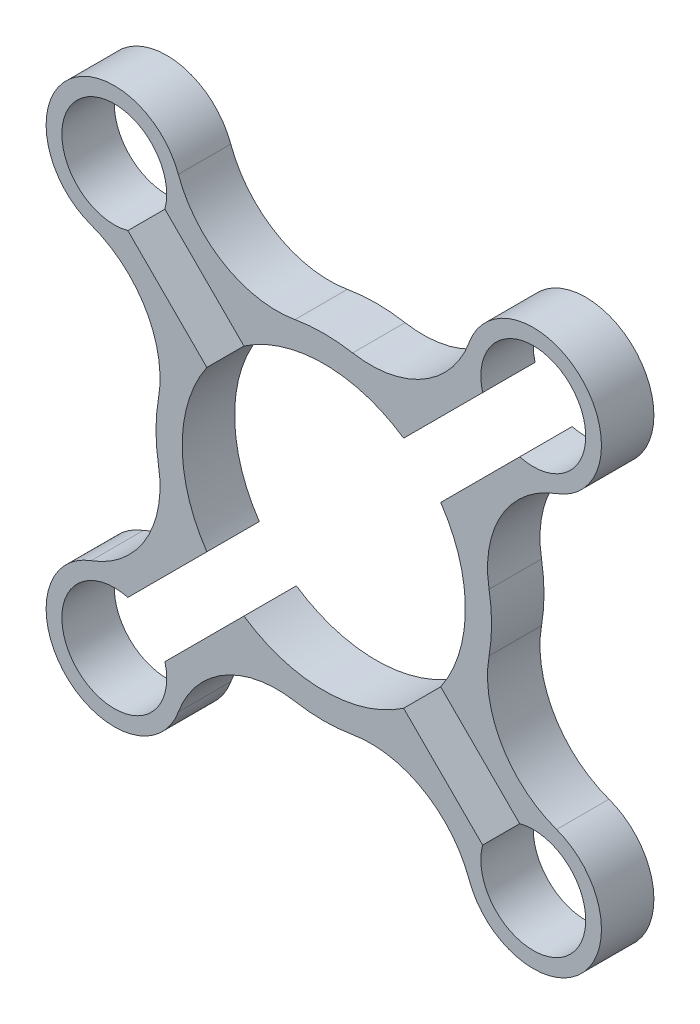
ISO-10303-21;
HEADER;
FILE_DESCRIPTION(('STEP AP214'),'2;1');
FILE_NAME('part.step','',(''),(''),'','','');
FILE_SCHEMA(('AUTOMOTIVE_DESIGN { 1 0 10303 214 1 1 1 1 }'));
ENDSEC;
DATA;
#1=APPLICATION_CONTEXT('core data for automotive mechanical design processes');
#2=APPLICATION_PROTOCOL_DEFINITION('international standard','automotive_design',2000,#1);
#3=PRODUCT_CONTEXT('',#1,'mechanical');
#4=PRODUCT('Part','Part','',(#3));
#5=PRODUCT_RELATED_PRODUCT_CATEGORY('part','',(#4));
#6=PRODUCT_DEFINITION_FORMATION('','',#4);
#7=PRODUCT_DEFINITION_CONTEXT('part definition',#1,'design');
#8=PRODUCT_DEFINITION('design','',#6,#7);
#9=PRODUCT_DEFINITION_SHAPE('','',#8);
#10=(LENGTH_UNIT() NAMED_UNIT(*) SI_UNIT(.MILLI.,.METRE.));
#11=(NAMED_UNIT(*) PLANE_ANGLE_UNIT() SI_UNIT($,.RADIAN.));
#12=(NAMED_UNIT(*) SI_UNIT($,.STERADIAN.) SOLID_ANGLE_UNIT());
#13=UNCERTAINTY_MEASURE_WITH_UNIT(LENGTH_MEASURE(1.E-05),#10,'distance_accuracy_value','');
#14=(GEOMETRIC_REPRESENTATION_CONTEXT(3) GLOBAL_UNCERTAINTY_ASSIGNED_CONTEXT((#13)) GLOBAL_UNIT_ASSIGNED_CONTEXT((#10,
#11,#12)) REPRESENTATION_CONTEXT('',''));
#15=CARTESIAN_POINT('',(0.,0.,0.));
#16=DIRECTION('',(0.,0.,1.));
#17=DIRECTION('',(1.,0.,0.));
#18=AXIS2_PLACEMENT_3D('',#15,#16,#17);
#19=CARTESIAN_POINT('',(51.2262080806969,-8.93731535043631,5.));
#20=DIRECTION('',(0.,0.,-1.));
#21=DIRECTION('',(-1.,0.,0.));
#22=AXIS2_PLACEMENT_3D('',#19,#20,#21);
#23=CYLINDRICAL_SURFACE('',#22,20.);
#24=CARTESIAN_POINT('',(51.2262080806969,-8.93731535043631,-5.));
#25=DIRECTION('',(0.,0.,1.));
#26=DIRECTION('',(1.,0.,0.));
#27=AXIS2_PLACEMENT_3D('',#24,#25,#26);
#28=CIRCLE('',#27,20.);
#29=CARTESIAN_POINT('',(31.5238203573519,-5.49988636949927,-5.));
#30=VERTEX_POINT('',#29);
#31=CARTESIAN_POINT('',(44.3930717512079,-27.7338109786809,-5.));
#32=VERTEX_POINT('',#31);
#33=EDGE_CURVE('E442',#30,#32,#28,.T.);
#34=ORIENTED_EDGE('',*,*,#33,.F.);
#35=DIRECTION('',(0.,0.,-1.));
#36=VECTOR('',#35,1.);
#37=CARTESIAN_POINT('',(31.5238203573519,-5.49988636949927,5.));
#38=LINE('',#37,#36);
#39=CARTESIAN_POINT('',(31.5238203573519,-5.49988636949927,5.));
#40=VERTEX_POINT('',#39);
#41=EDGE_CURVE('E11',#40,#30,#38,.T.);
#42=ORIENTED_EDGE('',*,*,#41,.F.);
#43=CARTESIAN_POINT('',(51.2262080806969,-8.93731535043631,5.));
#44=DIRECTION('',(0.,0.,1.));
#45=DIRECTION('',(1.,0.,0.));
#46=AXIS2_PLACEMENT_3D('',#43,#44,#45);
#47=CIRCLE('',#46,20.);
#48=CARTESIAN_POINT('',(44.3930717512079,-27.7338109786809,5.));
#49=VERTEX_POINT('',#48);
#50=EDGE_CURVE('E553',#40,#49,#47,.T.);
#51=ORIENTED_EDGE('',*,*,#50,.T.);
#52=DIRECTION('',(0.,0.,-1.));
#53=VECTOR('',#52,1.);
#54=CARTESIAN_POINT('',(44.3930717512079,-27.7338109786809,5.));
#55=LINE('',#54,#53);
#56=EDGE_CURVE('E169',#49,#32,#55,.T.);
#57=ORIENTED_EDGE('',*,*,#56,.T.);
#58=EDGE_LOOP('',(#34,#42,#51,#57));
#59=FACE_BOUND('',#58,.T.);
#60=ADVANCED_FACE('F43',(#59),#23,.F.);
#61=CARTESIAN_POINT('',(0.,0.,5.));
#62=DIRECTION('',(0.,0.,-1.));
#63=DIRECTION('',(-1.,0.,0.));
#64=AXIS2_PLACEMENT_3D('',#61,#62,#63);
#65=CYLINDRICAL_SURFACE('',#64,32.);
#66=CARTESIAN_POINT('',(0.,0.,-5.));
#67=DIRECTION('',(0.,0.,1.));
#68=DIRECTION('',(1.,0.,0.));
#69=AXIS2_PLACEMENT_3D('',#66,#67,#68);
#70=CIRCLE('',#69,32.);
#71=CARTESIAN_POINT('',(31.5238203573519,5.4998863694994,-5.));
#72=VERTEX_POINT('',#71);
#73=EDGE_CURVE('E438',#30,#72,#70,.T.);
#74=ORIENTED_EDGE('',*,*,#73,.T.);
#75=DIRECTION('',(0.,0.,-1.));
#76=VECTOR('',#75,1.);
#77=CARTESIAN_POINT('',(31.5238203573519,5.4998863694994,5.));
#78=LINE('',#77,#76);
#79=CARTESIAN_POINT('',(31.5238203573519,5.4998863694994,5.));
#80=VERTEX_POINT('',#79);
#81=EDGE_CURVE('E54',#80,#72,#78,.T.);
#82=ORIENTED_EDGE('',*,*,#81,.F.);
#83=CARTESIAN_POINT('',(0.,0.,5.));
#84=DIRECTION('',(0.,0.,1.));
#85=DIRECTION('',(1.,0.,0.));
#86=AXIS2_PLACEMENT_3D('',#83,#84,#85);
#87=CIRCLE('',#86,32.);
#88=EDGE_CURVE('E549',#40,#80,#87,.T.);
#89=ORIENTED_EDGE('',*,*,#88,.F.);
#90=ORIENTED_EDGE('',*,*,#41,.T.);
#91=EDGE_LOOP('',(#74,#82,#89,#90));
#92=FACE_BOUND('',#91,.T.);
#93=ADVANCED_FACE('F683',(#92),#65,.T.);
#94=CARTESIAN_POINT('',(51.2262080806969,8.93731535043653,5.));
#95=DIRECTION('',(0.,0.,-1.));
#96=DIRECTION('',(-1.,0.,0.));
#97=AXIS2_PLACEMENT_3D('',#94,#95,#96);
#98=CYLINDRICAL_SURFACE('',#97,20.);
#99=CARTESIAN_POINT('',(51.2262080806969,8.93731535043653,-5.));
#100=DIRECTION('',(0.,0.,1.));
#101=DIRECTION('',(1.,0.,0.));
#102=AXIS2_PLACEMENT_3D('',#99,#100,#101);
#103=CIRCLE('',#102,20.);
#104=CARTESIAN_POINT('',(44.3930717512078,27.7338109786811,-5.));
#105=VERTEX_POINT('',#104);
#106=EDGE_CURVE('E434',#72,#105,#103,.F.);
#107=ORIENTED_EDGE('',*,*,#106,.T.);
#108=DIRECTION('',(0.,0.,-1.));
#109=VECTOR('',#108,1.);
#110=CARTESIAN_POINT('',(44.3930717512078,27.7338109786811,5.));
#111=LINE('',#110,#109);
#112=CARTESIAN_POINT('',(44.3930717512078,27.7338109786811,5.));
#113=VERTEX_POINT('',#112);
#114=EDGE_CURVE('E326',#113,#105,#111,.T.);
#115=ORIENTED_EDGE('',*,*,#114,.F.);
#116=CARTESIAN_POINT('',(51.2262080806969,8.93731535043653,5.));
#117=DIRECTION('',(0.,0.,1.));
#118=DIRECTION('',(1.,0.,0.));
#119=AXIS2_PLACEMENT_3D('',#116,#117,#118);
#120=CIRCLE('',#119,20.);
#121=EDGE_CURVE('E545',#80,#113,#120,.F.);
#122=ORIENTED_EDGE('',*,*,#121,.F.);
#123=ORIENTED_EDGE('',*,*,#81,.T.);
#124=EDGE_LOOP('',(#107,#115,#122,#123));
#125=FACE_BOUND('',#124,.T.);
#126=ADVANCED_FACE('F688',(#125),#98,.F.);
#127=CARTESIAN_POINT('',(39.9515331370399,39.95153313704,5.));
#128=DIRECTION('',(0.,0.,-1.));
#129=DIRECTION('',(-1.,0.,0.));
#130=AXIS2_PLACEMENT_3D('',#127,#128,#129);
#131=CYLINDRICAL_SURFACE('',#130,13.);
#132=CARTESIAN_POINT('',(39.9515331370399,39.95153313704,-5.));
#133=DIRECTION('',(0.,0.,1.));
#134=DIRECTION('',(1.,0.,0.));
#135=AXIS2_PLACEMENT_3D('',#132,#133,#134);
#136=CIRCLE('',#135,13.);
#137=CARTESIAN_POINT('',(27.7338109786809,44.3930717512079,-5.));
#138=VERTEX_POINT('',#137);
#139=EDGE_CURVE('E430',#105,#138,#136,.T.);
#140=ORIENTED_EDGE('',*,*,#139,.T.);
#141=DIRECTION('',(0.,0.,-1.));
#142=VECTOR('',#141,1.);
#143=CARTESIAN_POINT('',(27.7338109786809,44.3930717512079,5.));
#144=LINE('',#143,#142);
#145=CARTESIAN_POINT('',(27.7338109786809,44.3930717512079,5.));
#146=VERTEX_POINT('',#145);
#147=EDGE_CURVE('E323',#146,#138,#144,.T.);
#148=ORIENTED_EDGE('',*,*,#147,.F.);
#149=CARTESIAN_POINT('',(39.9515331370399,39.95153313704,5.));
#150=DIRECTION('',(0.,0.,1.));
#151=DIRECTION('',(1.,0.,0.));
#152=AXIS2_PLACEMENT_3D('',#149,#150,#151);
#153=CIRCLE('',#152,13.);
#154=EDGE_CURVE('E542',#113,#146,#153,.T.);
#155=ORIENTED_EDGE('',*,*,#154,.F.);
#156=ORIENTED_EDGE('',*,*,#114,.T.);
#157=EDGE_LOOP('',(#140,#148,#155,#156));
#158=FACE_BOUND('',#157,.T.);
#159=ADVANCED_FACE('F694',(#158),#131,.T.);
#160=CARTESIAN_POINT('',(8.93731535043632,51.2262080806969,5.));
#161=DIRECTION('',(0.,0.,-1.));
#162=DIRECTION('',(-1.,0.,0.));
#163=AXIS2_PLACEMENT_3D('',#160,#161,#162);
#164=CYLINDRICAL_SURFACE('',#163,20.);
#165=CARTESIAN_POINT('',(8.93731535043632,51.2262080806969,-5.));
#166=DIRECTION('',(0.,0.,1.));
#167=DIRECTION('',(1.,0.,0.));
#168=AXIS2_PLACEMENT_3D('',#165,#166,#167);
#169=CIRCLE('',#168,20.);
#170=CARTESIAN_POINT('',(5.49988636949927,31.5238203573519,-5.));
#171=VERTEX_POINT('',#170);
#172=EDGE_CURVE('E426',#171,#138,#169,.T.);
#173=ORIENTED_EDGE('',*,*,#172,.F.);
#174=DIRECTION('',(0.,0.,-1.));
#175=VECTOR('',#174,1.);
#176=CARTESIAN_POINT('',(5.49988636949927,31.5238203573519,5.));
#177=LINE('',#176,#175);
#178=CARTESIAN_POINT('',(5.49988636949927,31.5238203573519,5.));
#179=VERTEX_POINT('',#178);
#180=EDGE_CURVE('E320',#179,#171,#177,.T.);
#181=ORIENTED_EDGE('',*,*,#180,.F.);
#182=CARTESIAN_POINT('',(8.93731535043632,51.2262080806969,5.));
#183=DIRECTION('',(0.,0.,1.));
#184=DIRECTION('',(1.,0.,0.));
#185=AXIS2_PLACEMENT_3D('',#182,#183,#184);
#186=CIRCLE('',#185,20.);
#187=EDGE_CURVE('E538',#179,#146,#186,.T.);
#188=ORIENTED_EDGE('',*,*,#187,.T.);
#189=ORIENTED_EDGE('',*,*,#147,.T.);
#190=EDGE_LOOP('',(#173,#181,#188,#189));
#191=FACE_BOUND('',#190,.T.);
#192=ADVANCED_FACE('F698',(#191),#164,.F.);
#193=CARTESIAN_POINT('',(0.,0.,5.));
#194=DIRECTION('',(0.,0.,-1.));
#195=DIRECTION('',(-1.,0.,0.));
#196=AXIS2_PLACEMENT_3D('',#193,#194,#195);
#197=CYLINDRICAL_SURFACE('',#196,32.);
#198=CARTESIAN_POINT('',(0.,0.,-5.));
#199=DIRECTION('',(0.,0.,1.));
#200=DIRECTION('',(1.,0.,0.));
#201=AXIS2_PLACEMENT_3D('',#198,#199,#200);
#202=CIRCLE('',#201,32.);
#203=CARTESIAN_POINT('',(-5.4998863694994,31.5238203573519,-5.));
#204=VERTEX_POINT('',#203);
#205=EDGE_CURVE('E422',#171,#204,#202,.T.);
#206=ORIENTED_EDGE('',*,*,#205,.T.);
#207=DIRECTION('',(0.,0.,-1.));
#208=VECTOR('',#207,1.);
#209=CARTESIAN_POINT('',(-5.4998863694994,31.5238203573519,5.));
#210=LINE('',#209,#208);
#211=CARTESIAN_POINT('',(-5.4998863694994,31.5238203573519,5.));
#212=VERTEX_POINT('',#211);
#213=EDGE_CURVE('E316',#212,#204,#210,.T.);
#214=ORIENTED_EDGE('',*,*,#213,.F.);
#215=CARTESIAN_POINT('',(0.,0.,5.));
#216=DIRECTION('',(0.,0.,1.));
#217=DIRECTION('',(1.,0.,0.));
#218=AXIS2_PLACEMENT_3D('',#215,#216,#217);
#219=CIRCLE('',#218,32.);
#220=EDGE_CURVE('E534',#179,#212,#219,.T.);
#221=ORIENTED_EDGE('',*,*,#220,.F.);
#222=ORIENTED_EDGE('',*,*,#180,.T.);
#223=EDGE_LOOP('',(#206,#214,#221,#222));
#224=FACE_BOUND('',#223,.T.);
#225=ADVANCED_FACE('F702',(#224),#197,.T.);
#226=CARTESIAN_POINT('',(-8.93731535043652,51.2262080806968,5.));
#227=DIRECTION('',(0.,0.,-1.));
#228=DIRECTION('',(-1.,0.,0.));
#229=AXIS2_PLACEMENT_3D('',#226,#227,#228);
#230=CYLINDRICAL_SURFACE('',#229,20.);
#231=CARTESIAN_POINT('',(-8.93731535043652,51.2262080806968,-5.));
#232=DIRECTION('',(0.,0.,1.));
#233=DIRECTION('',(1.,0.,0.));
#234=AXIS2_PLACEMENT_3D('',#231,#232,#233);
#235=CIRCLE('',#234,20.);
#236=CARTESIAN_POINT('',(-27.7338109786811,44.3930717512077,-5.));
#237=VERTEX_POINT('',#236);
#238=EDGE_CURVE('E418',#204,#237,#235,.F.);
#239=ORIENTED_EDGE('',*,*,#238,.T.);
#240=DIRECTION('',(0.,0.,-1.));
#241=VECTOR('',#240,1.);
#242=CARTESIAN_POINT('',(-27.7338109786811,44.3930717512077,5.));
#243=LINE('',#242,#241);
#244=CARTESIAN_POINT('',(-27.7338109786811,44.3930717512077,5.));
#245=VERTEX_POINT('',#244);
#246=EDGE_CURVE('E312',#245,#237,#243,.T.);
#247=ORIENTED_EDGE('',*,*,#246,.F.);
#248=CARTESIAN_POINT('',(-8.93731535043652,51.2262080806968,5.));
#249=DIRECTION('',(0.,0.,1.));
#250=DIRECTION('',(1.,0.,0.));
#251=AXIS2_PLACEMENT_3D('',#248,#249,#250);
#252=CIRCLE('',#251,20.);
#253=EDGE_CURVE('E530',#212,#245,#252,.F.);
#254=ORIENTED_EDGE('',*,*,#253,.F.);
#255=ORIENTED_EDGE('',*,*,#213,.T.);
#256=EDGE_LOOP('',(#239,#247,#254,#255));
#257=FACE_BOUND('',#256,.T.);
#258=ADVANCED_FACE('F706',(#257),#230,.F.);
#259=CARTESIAN_POINT('',(-39.95153313704,39.9515331370398,5.));
#260=DIRECTION('',(0.,0.,-1.));
#261=DIRECTION('',(-1.,0.,0.));
#262=AXIS2_PLACEMENT_3D('',#259,#260,#261);
#263=CYLINDRICAL_SURFACE('',#262,13.);
#264=CARTESIAN_POINT('',(-39.95153313704,39.9515331370398,-5.));
#265=DIRECTION('',(0.,0.,1.));
#266=DIRECTION('',(1.,0.,0.));
#267=AXIS2_PLACEMENT_3D('',#264,#265,#266);
#268=CIRCLE('',#267,13.);
#269=CARTESIAN_POINT('',(-44.3930717512079,27.7338109786809,-5.));
#270=VERTEX_POINT('',#269);
#271=EDGE_CURVE('E414',#237,#270,#268,.T.);
#272=ORIENTED_EDGE('',*,*,#271,.T.);
#273=DIRECTION('',(0.,0.,-1.));
#274=VECTOR('',#273,1.);
#275=CARTESIAN_POINT('',(-44.3930717512079,27.7338109786809,5.));
#276=LINE('',#275,#274);
#277=CARTESIAN_POINT('',(-44.3930717512079,27.7338109786809,5.));
#278=VERTEX_POINT('',#277);
#279=EDGE_CURVE('E309',#278,#270,#276,.T.);
#280=ORIENTED_EDGE('',*,*,#279,.F.);
#281=CARTESIAN_POINT('',(-39.95153313704,39.9515331370398,5.));
#282=DIRECTION('',(0.,0.,1.));
#283=DIRECTION('',(1.,0.,0.));
#284=AXIS2_PLACEMENT_3D('',#281,#282,#283);
#285=CIRCLE('',#284,13.);
#286=EDGE_CURVE('E527',#245,#278,#285,.T.);
#287=ORIENTED_EDGE('',*,*,#286,.F.);
#288=ORIENTED_EDGE('',*,*,#246,.T.);
#289=EDGE_LOOP('',(#272,#280,#287,#288));
#290=FACE_BOUND('',#289,.T.);
#291=ADVANCED_FACE('F710',(#290),#263,.T.);
#292=CARTESIAN_POINT('',(-51.2262080806969,8.93731535043631,5.));
#293=DIRECTION('',(0.,0.,-1.));
#294=DIRECTION('',(-1.,0.,0.));
#295=AXIS2_PLACEMENT_3D('',#292,#293,#294);
#296=CYLINDRICAL_SURFACE('',#295,20.);
#297=CARTESIAN_POINT('',(-51.2262080806969,8.93731535043631,-5.));
#298=DIRECTION('',(0.,0.,1.));
#299=DIRECTION('',(1.,0.,0.));
#300=AXIS2_PLACEMENT_3D('',#297,#298,#299);
#301=CIRCLE('',#300,20.);
#302=CARTESIAN_POINT('',(-31.5238203573519,5.49988636949927,-5.));
#303=VERTEX_POINT('',#302);
#304=EDGE_CURVE('E410',#303,#270,#301,.T.);
#305=ORIENTED_EDGE('',*,*,#304,.F.);
#306=DIRECTION('',(0.,0.,-1.));
#307=VECTOR('',#306,1.);
#308=CARTESIAN_POINT('',(-31.5238203573519,5.49988636949927,5.));
#309=LINE('',#308,#307);
#310=CARTESIAN_POINT('',(-31.5238203573519,5.49988636949927,5.));
#311=VERTEX_POINT('',#310);
#312=EDGE_CURVE('E306',#311,#303,#309,.T.);
#313=ORIENTED_EDGE('',*,*,#312,.F.);
#314=CARTESIAN_POINT('',(-51.2262080806969,8.93731535043631,5.));
#315=DIRECTION('',(0.,0.,1.));
#316=DIRECTION('',(1.,0.,0.));
#317=AXIS2_PLACEMENT_3D('',#314,#315,#316);
#318=CIRCLE('',#317,20.);
#319=EDGE_CURVE('E523',#311,#278,#318,.T.);
#320=ORIENTED_EDGE('',*,*,#319,.T.);
#321=ORIENTED_EDGE('',*,*,#279,.T.);
#322=EDGE_LOOP('',(#305,#313,#320,#321));
#323=FACE_BOUND('',#322,.T.);
#324=ADVANCED_FACE('F714',(#323),#296,.F.);
#325=CARTESIAN_POINT('',(0.,0.,5.));
#326=DIRECTION('',(0.,0.,-1.));
#327=DIRECTION('',(-1.,0.,0.));
#328=AXIS2_PLACEMENT_3D('',#325,#326,#327);
#329=CYLINDRICAL_SURFACE('',#328,32.);
#330=CARTESIAN_POINT('',(0.,0.,-5.));
#331=DIRECTION('',(0.,0.,1.));
#332=DIRECTION('',(1.,0.,0.));
#333=AXIS2_PLACEMENT_3D('',#330,#331,#332);
#334=CIRCLE('',#333,32.);
#335=CARTESIAN_POINT('',(-31.5238203573519,-5.49988636949939,-5.));
#336=VERTEX_POINT('',#335);
#337=EDGE_CURVE('E406',#303,#336,#334,.T.);
#338=ORIENTED_EDGE('',*,*,#337,.T.);
#339=DIRECTION('',(0.,0.,-1.));
#340=VECTOR('',#339,1.);
#341=CARTESIAN_POINT('',(-31.5238203573519,-5.49988636949939,5.));
#342=LINE('',#341,#340);
#343=CARTESIAN_POINT('',(-31.5238203573519,-5.49988636949939,5.));
#344=VERTEX_POINT('',#343);
#345=EDGE_CURVE('E302',#344,#336,#342,.T.);
#346=ORIENTED_EDGE('',*,*,#345,.F.);
#347=CARTESIAN_POINT('',(0.,0.,5.));
#348=DIRECTION('',(0.,0.,1.));
#349=DIRECTION('',(1.,0.,0.));
#350=AXIS2_PLACEMENT_3D('',#347,#348,#349);
#351=CIRCLE('',#350,32.);
#352=EDGE_CURVE('E519',#311,#344,#351,.T.);
#353=ORIENTED_EDGE('',*,*,#352,.F.);
#354=ORIENTED_EDGE('',*,*,#312,.T.);
#355=EDGE_LOOP('',(#338,#346,#353,#354));
#356=FACE_BOUND('',#355,.T.);
#357=ADVANCED_FACE('F718',(#356),#329,.T.);
#358=CARTESIAN_POINT('',(-51.2262080806968,-8.93731535043652,5.));
#359=DIRECTION('',(0.,0.,-1.));
#360=DIRECTION('',(-1.,0.,0.));
#361=AXIS2_PLACEMENT_3D('',#358,#359,#360);
#362=CYLINDRICAL_SURFACE('',#361,20.);
#363=CARTESIAN_POINT('',(-51.2262080806968,-8.93731535043652,-5.));
#364=DIRECTION('',(0.,0.,1.));
#365=DIRECTION('',(1.,0.,0.));
#366=AXIS2_PLACEMENT_3D('',#363,#364,#365);
#367=CIRCLE('',#366,20.);
#368=CARTESIAN_POINT('',(-44.3930717512078,-27.7338109786811,-5.));
#369=VERTEX_POINT('',#368);
#370=EDGE_CURVE('E402',#336,#369,#367,.F.);
#371=ORIENTED_EDGE('',*,*,#370,.T.);
#372=DIRECTION('',(0.,0.,-1.));
#373=VECTOR('',#372,1.);
#374=CARTESIAN_POINT('',(-44.3930717512078,-27.7338109786811,5.));
#375=LINE('',#374,#373);
#376=CARTESIAN_POINT('',(-44.3930717512078,-27.7338109786811,5.));
#377=VERTEX_POINT('',#376);
#378=EDGE_CURVE('E298',#377,#369,#375,.T.);
#379=ORIENTED_EDGE('',*,*,#378,.F.);
#380=CARTESIAN_POINT('',(-51.2262080806968,-8.93731535043652,5.));
#381=DIRECTION('',(0.,0.,1.));
#382=DIRECTION('',(1.,0.,0.));
#383=AXIS2_PLACEMENT_3D('',#380,#381,#382);
#384=CIRCLE('',#383,20.);
#385=EDGE_CURVE('E515',#344,#377,#384,.F.);
#386=ORIENTED_EDGE('',*,*,#385,.F.);
#387=ORIENTED_EDGE('',*,*,#345,.T.);
#388=EDGE_LOOP('',(#371,#379,#386,#387));
#389=FACE_BOUND('',#388,.T.);
#390=ADVANCED_FACE('F722',(#389),#362,.F.);
#391=CARTESIAN_POINT('',(-39.9515331370398,-39.95153313704,5.));
#392=DIRECTION('',(0.,0.,-1.));
#393=DIRECTION('',(-1.,0.,0.));
#394=AXIS2_PLACEMENT_3D('',#391,#392,#393);
#395=CYLINDRICAL_SURFACE('',#394,13.);
#396=CARTESIAN_POINT('',(-39.9515331370398,-39.95153313704,-5.));
#397=DIRECTION('',(0.,0.,1.));
#398=DIRECTION('',(1.,0.,0.));
#399=AXIS2_PLACEMENT_3D('',#396,#397,#398);
#400=CIRCLE('',#399,13.);
#401=CARTESIAN_POINT('',(-27.7338109786809,-44.3930717512079,-5.));
#402=VERTEX_POINT('',#401);
#403=EDGE_CURVE('E398',#369,#402,#400,.T.);
#404=ORIENTED_EDGE('',*,*,#403,.T.);
#405=DIRECTION('',(0.,0.,-1.));
#406=VECTOR('',#405,1.);
#407=CARTESIAN_POINT('',(-27.7338109786809,-44.3930717512079,5.));
#408=LINE('',#407,#406);
#409=CARTESIAN_POINT('',(-27.7338109786809,-44.3930717512079,5.));
#410=VERTEX_POINT('',#409);
#411=EDGE_CURVE('E291',#410,#402,#408,.T.);
#412=ORIENTED_EDGE('',*,*,#411,.F.);
#413=CARTESIAN_POINT('',(-39.9515331370398,-39.95153313704,5.));
#414=DIRECTION('',(0.,0.,1.));
#415=DIRECTION('',(1.,0.,0.));
#416=AXIS2_PLACEMENT_3D('',#413,#414,#415);
#417=CIRCLE('',#416,13.);
#418=EDGE_CURVE('E512',#377,#410,#417,.T.);
#419=ORIENTED_EDGE('',*,*,#418,.F.);
#420=ORIENTED_EDGE('',*,*,#378,.T.);
#421=EDGE_LOOP('',(#404,#412,#419,#420));
#422=FACE_BOUND('',#421,.T.);
#423=ADVANCED_FACE('F726',(#422),#395,.T.);
#424=CARTESIAN_POINT('',(-8.93731535043631,-51.2262080806969,5.));
#425=DIRECTION('',(0.,0.,-1.));
#426=DIRECTION('',(-1.,0.,0.));
#427=AXIS2_PLACEMENT_3D('',#424,#425,#426);
#428=CYLINDRICAL_SURFACE('',#427,20.);
#429=CARTESIAN_POINT('',(-8.93731535043631,-51.2262080806969,-5.));
#430=DIRECTION('',(0.,0.,1.));
#431=DIRECTION('',(1.,0.,0.));
#432=AXIS2_PLACEMENT_3D('',#429,#430,#431);
#433=CIRCLE('',#432,20.);
#434=CARTESIAN_POINT('',(-5.49988636949927,-31.5238203573519,-5.));
#435=VERTEX_POINT('',#434);
#436=EDGE_CURVE('E394',#435,#402,#433,.T.);
#437=ORIENTED_EDGE('',*,*,#436,.F.);
#438=DIRECTION('',(0.,0.,-1.));
#439=VECTOR('',#438,1.);
#440=CARTESIAN_POINT('',(-5.49988636949927,-31.5238203573519,5.));
#441=LINE('',#440,#439);
#442=CARTESIAN_POINT('',(-5.49988636949927,-31.5238203573519,5.));
#443=VERTEX_POINT('',#442);
#444=EDGE_CURVE('E287',#443,#435,#441,.T.);
#445=ORIENTED_EDGE('',*,*,#444,.F.);
#446=CARTESIAN_POINT('',(-8.93731535043631,-51.2262080806969,5.));
#447=DIRECTION('',(0.,0.,1.));
#448=DIRECTION('',(1.,0.,0.));
#449=AXIS2_PLACEMENT_3D('',#446,#447,#448);
#450=CIRCLE('',#449,20.);
#451=EDGE_CURVE('E279',#443,#410,#450,.T.);
#452=ORIENTED_EDGE('',*,*,#451,.T.);
#453=ORIENTED_EDGE('',*,*,#411,.T.);
#454=EDGE_LOOP('',(#437,#445,#452,#453));
#455=FACE_BOUND('',#454,.T.);
#456=ADVANCED_FACE('F730',(#455),#428,.F.);
#457=CARTESIAN_POINT('',(0.,0.,5.));
#458=DIRECTION('',(0.,0.,-1.));
#459=DIRECTION('',(-1.,0.,0.));
#460=AXIS2_PLACEMENT_3D('',#457,#458,#459);
#461=CYLINDRICAL_SURFACE('',#460,32.);
#462=CARTESIAN_POINT('',(0.,0.,-5.));
#463=DIRECTION('',(0.,0.,1.));
#464=DIRECTION('',(1.,0.,0.));
#465=AXIS2_PLACEMENT_3D('',#462,#463,#464);
#466=CIRCLE('',#465,32.);
#467=CARTESIAN_POINT('',(5.4998863694994,-31.5238203573519,-5.));
#468=VERTEX_POINT('',#467);
#469=EDGE_CURVE('E285',#435,#468,#466,.T.);
#470=ORIENTED_EDGE('',*,*,#469,.T.);
#471=DIRECTION('',(0.,0.,-1.));
#472=VECTOR('',#471,1.);
#473=CARTESIAN_POINT('',(5.4998863694994,-31.5238203573519,5.));
#474=LINE('',#473,#472);
#475=CARTESIAN_POINT('',(5.4998863694994,-31.5238203573519,5.));
#476=VERTEX_POINT('',#475);
#477=EDGE_CURVE('E269',#476,#468,#474,.T.);
#478=ORIENTED_EDGE('',*,*,#477,.F.);
#479=CARTESIAN_POINT('',(0.,0.,5.));
#480=DIRECTION('',(0.,0.,1.));
#481=DIRECTION('',(1.,0.,0.));
#482=AXIS2_PLACEMENT_3D('',#479,#480,#481);
#483=CIRCLE('',#482,32.);
#484=EDGE_CURVE('E273',#443,#476,#483,.T.);
#485=ORIENTED_EDGE('',*,*,#484,.F.);
#486=ORIENTED_EDGE('',*,*,#444,.T.);
#487=EDGE_LOOP('',(#470,#478,#485,#486));
#488=FACE_BOUND('',#487,.T.);
#489=ADVANCED_FACE('F283',(#488),#461,.T.);
#490=CARTESIAN_POINT('',(8.93731535043652,-51.2262080806968,5.));
#491=DIRECTION('',(0.,0.,-1.));
#492=DIRECTION('',(-1.,0.,0.));
#493=AXIS2_PLACEMENT_3D('',#490,#491,#492);
#494=CYLINDRICAL_SURFACE('',#493,20.);
#495=CARTESIAN_POINT('',(8.93731535043652,-51.2262080806968,-5.));
#496=DIRECTION('',(0.,0.,1.));
#497=DIRECTION('',(1.,0.,0.));
#498=AXIS2_PLACEMENT_3D('',#495,#496,#497);
#499=CIRCLE('',#498,20.);
#500=CARTESIAN_POINT('',(27.7338109786811,-44.3930717512078,-5.));
#501=VERTEX_POINT('',#500);
#502=EDGE_CURVE('E389',#468,#501,#499,.F.);
#503=ORIENTED_EDGE('',*,*,#502,.T.);
#504=DIRECTION('',(0.,0.,-1.));
#505=VECTOR('',#504,1.);
#506=CARTESIAN_POINT('',(27.7338109786811,-44.3930717512078,5.));
#507=LINE('',#506,#505);
#508=CARTESIAN_POINT('',(27.7338109786811,-44.3930717512078,5.));
#509=VERTEX_POINT('',#508);
#510=EDGE_CURVE('E271',#509,#501,#507,.T.);
#511=ORIENTED_EDGE('',*,*,#510,.F.);
#512=CARTESIAN_POINT('',(8.93731535043652,-51.2262080806968,5.));
#513=DIRECTION('',(0.,0.,1.));
#514=DIRECTION('',(1.,0.,0.));
#515=AXIS2_PLACEMENT_3D('',#512,#513,#514);
#516=CIRCLE('',#515,20.);
#517=EDGE_CURVE('E264',#476,#509,#516,.F.);
#518=ORIENTED_EDGE('',*,*,#517,.F.);
#519=ORIENTED_EDGE('',*,*,#477,.T.);
#520=EDGE_LOOP('',(#503,#511,#518,#519));
#521=FACE_BOUND('',#520,.T.);
#522=ADVANCED_FACE('F267',(#521),#494,.F.);
#523=CARTESIAN_POINT('',(0.,0.,5.));
#524=DIRECTION('',(0.,0.,-1.));
#525=DIRECTION('',(-1.,0.,0.));
#526=AXIS2_PLACEMENT_3D('',#523,#524,#525);
#527=CYLINDRICAL_SURFACE('',#526,27.);
#528=CARTESIAN_POINT('',(0.,0.,-5.));
#529=DIRECTION('',(0.,0.,1.));
#530=DIRECTION('',(1.,0.,0.));
#531=AXIS2_PLACEMENT_3D('',#528,#529,#530);
#532=CIRCLE('',#531,27.);
#533=CARTESIAN_POINT('',(22.2971969452265,-15.2261291333609,-5.));
#534=VERTEX_POINT('',#533);
#535=CARTESIAN_POINT('',(22.2971969452264,15.226129133361,-5.));
#536=VERTEX_POINT('',#535);
#537=EDGE_CURVE('E504',#534,#536,#532,.T.);
#538=ORIENTED_EDGE('',*,*,#537,.F.);
#539=DIRECTION('',(0.,0.,-1.));
#540=VECTOR('',#539,1.);
#541=CARTESIAN_POINT('',(22.2971969452265,-15.2261291333609,5.));
#542=LINE('',#541,#540);
#543=CARTESIAN_POINT('',(22.2971969452265,-15.2261291333609,5.));
#544=VERTEX_POINT('',#543);
#545=EDGE_CURVE('E47',#544,#534,#542,.T.);
#546=ORIENTED_EDGE('',*,*,#545,.F.);
#547=CARTESIAN_POINT('',(0.,0.,5.));
#548=DIRECTION('',(0.,0.,1.));
#549=DIRECTION('',(1.,0.,0.));
#550=AXIS2_PLACEMENT_3D('',#547,#548,#549);
#551=CIRCLE('',#550,27.);
#552=CARTESIAN_POINT('',(22.2971969452264,15.226129133361,5.));
#553=VERTEX_POINT('',#552);
#554=EDGE_CURVE('E388',#544,#553,#551,.T.);
#555=ORIENTED_EDGE('',*,*,#554,.T.);
#556=DIRECTION('',(0.,0.,-1.));
#557=VECTOR('',#556,1.);
#558=CARTESIAN_POINT('',(22.2971969452264,15.226129133361,5.));
#559=LINE('',#558,#557);
#560=EDGE_CURVE('E333',#553,#536,#559,.T.);
#561=ORIENTED_EDGE('',*,*,#560,.T.);
#562=EDGE_LOOP('',(#538,#546,#555,#561));
#563=FACE_BOUND('',#562,.T.);
#564=ADVANCED_FACE('F45',(#563),#527,.F.);
#565=CARTESIAN_POINT('',(3.53553390593272,3.53553390593273,5.));
#566=DIRECTION('',(0.707106781186546,0.707106781186549,0.));
#567=DIRECTION('',(-0.707106781186549,0.707106781186546,0.));
#568=AXIS2_PLACEMENT_3D('',#565,#566,#567);
#569=PLANE('',#568);
#570=DIRECTION('',(0.707106781186549,-0.707106781186546,0.));
#571=VECTOR('',#570,1.);
#572=CARTESIAN_POINT('',(3.53553390593272,3.53553390593273,-5.));
#573=LINE('',#572,#571);
#574=CARTESIAN_POINT('',(37.3633426860148,-30.2922748741492,-5.));
#575=VERTEX_POINT('',#574);
#576=EDGE_CURVE('E501',#534,#575,#573,.T.);
#577=ORIENTED_EDGE('',*,*,#576,.T.);
#578=DIRECTION('',(0.,0.,-1.));
#579=VECTOR('',#578,1.);
#580=CARTESIAN_POINT('',(37.3633426860148,-30.2922748741492,5.));
#581=LINE('',#580,#579);
#582=CARTESIAN_POINT('',(37.3633426860148,-30.2922748741492,5.));
#583=VERTEX_POINT('',#582);
#584=EDGE_CURVE('E374',#583,#575,#581,.T.);
#585=ORIENTED_EDGE('',*,*,#584,.F.);
#586=DIRECTION('',(0.707106781186549,-0.707106781186546,0.));
#587=VECTOR('',#586,1.);
#588=CARTESIAN_POINT('',(3.53553390593272,3.53553390593273,5.));
#589=LINE('',#588,#587);
#590=EDGE_CURVE('E608',#544,#583,#589,.T.);
#591=ORIENTED_EDGE('',*,*,#590,.F.);
#592=ORIENTED_EDGE('',*,*,#545,.T.);
#593=EDGE_LOOP('',(#577,#585,#591,#592));
#594=FACE_BOUND('',#593,.T.);
#595=ADVANCED_FACE('F623',(#594),#569,.F.);
#596=CARTESIAN_POINT('',(39.95153313704,-39.9515331370399,5.));
#597=DIRECTION('',(0.,0.,-1.));
#598=DIRECTION('',(-1.,0.,0.));
#599=AXIS2_PLACEMENT_3D('',#596,#597,#598);
#600=CYLINDRICAL_SURFACE('',#599,9.99999999999999);
#601=CARTESIAN_POINT('',(39.95153313704,-39.9515331370399,-5.));
#602=DIRECTION('',(0.,0.,1.));
#603=DIRECTION('',(1.,0.,0.));
#604=AXIS2_PLACEMENT_3D('',#601,#602,#603);
#605=CIRCLE('',#604,9.99999999999999);
#606=CARTESIAN_POINT('',(30.2922748741493,-37.3633426860147,-5.));
#607=VERTEX_POINT('',#606);
#608=EDGE_CURVE('E497',#607,#575,#605,.T.);
#609=ORIENTED_EDGE('',*,*,#608,.F.);
#610=DIRECTION('',(0.,0.,-1.));
#611=VECTOR('',#610,1.);
#612=CARTESIAN_POINT('',(30.2922748741493,-37.3633426860147,5.));
#613=LINE('',#612,#611);
#614=CARTESIAN_POINT('',(30.2922748741493,-37.3633426860147,5.));
#615=VERTEX_POINT('',#614);
#616=EDGE_CURVE('E372',#615,#607,#613,.T.);
#617=ORIENTED_EDGE('',*,*,#616,.F.);
#618=CARTESIAN_POINT('',(39.95153313704,-39.9515331370399,5.));
#619=DIRECTION('',(0.,0.,1.));
#620=DIRECTION('',(1.,0.,0.));
#621=AXIS2_PLACEMENT_3D('',#618,#619,#620);
#622=CIRCLE('',#621,9.99999999999999);
#623=EDGE_CURVE('E605',#615,#583,#622,.T.);
#624=ORIENTED_EDGE('',*,*,#623,.T.);
#625=ORIENTED_EDGE('',*,*,#584,.T.);
#626=EDGE_LOOP('',(#609,#617,#624,#625));
#627=FACE_BOUND('',#626,.T.);
#628=ADVANCED_FACE('F625',(#627),#600,.F.);
#629=CARTESIAN_POINT('',(-3.53553390593273,-3.53553390593275,5.));
#630=DIRECTION('',(0.707106781186546,0.707106781186549,0.));
#631=DIRECTION('',(-0.707106781186549,0.707106781186546,0.));
#632=AXIS2_PLACEMENT_3D('',#629,#630,#631);
#633=PLANE('',#632);
#634=DIRECTION('',(0.707106781186549,-0.707106781186546,0.));
#635=VECTOR('',#634,1.);
#636=CARTESIAN_POINT('',(-3.53553390593273,-3.53553390593275,-5.));
#637=LINE('',#636,#635);
#638=CARTESIAN_POINT('',(15.226129133361,-22.2971969452264,-5.));
#639=VERTEX_POINT('',#638);
#640=EDGE_CURVE('E493',#639,#607,#637,.T.);
#641=ORIENTED_EDGE('',*,*,#640,.F.);
#642=DIRECTION('',(0.,0.,-1.));
#643=VECTOR('',#642,1.);
#644=CARTESIAN_POINT('',(15.226129133361,-22.2971969452264,5.));
#645=LINE('',#644,#643);
#646=CARTESIAN_POINT('',(15.226129133361,-22.2971969452264,5.));
#647=VERTEX_POINT('',#646);
#648=EDGE_CURVE('E369',#647,#639,#645,.T.);
#649=ORIENTED_EDGE('',*,*,#648,.F.);
#650=DIRECTION('',(0.707106781186549,-0.707106781186546,0.));
#651=VECTOR('',#650,1.);
#652=CARTESIAN_POINT('',(-3.53553390593273,-3.53553390593275,5.));
#653=LINE('',#652,#651);
#654=EDGE_CURVE('E601',#647,#615,#653,.T.);
#655=ORIENTED_EDGE('',*,*,#654,.T.);
#656=ORIENTED_EDGE('',*,*,#616,.T.);
#657=EDGE_LOOP('',(#641,#649,#655,#656));
#658=FACE_BOUND('',#657,.T.);
#659=ADVANCED_FACE('F630',(#658),#633,.T.);
#660=CARTESIAN_POINT('',(0.,0.,5.));
#661=DIRECTION('',(0.,0.,-1.));
#662=DIRECTION('',(-1.,0.,0.));
#663=AXIS2_PLACEMENT_3D('',#660,#661,#662);
#664=CYLINDRICAL_SURFACE('',#663,27.);
#665=CARTESIAN_POINT('',(0.,0.,-5.));
#666=DIRECTION('',(0.,0.,1.));
#667=DIRECTION('',(1.,0.,0.));
#668=AXIS2_PLACEMENT_3D('',#665,#666,#667);
#669=CIRCLE('',#668,27.);
#670=CARTESIAN_POINT('',(-15.2261291333609,-22.2971969452265,-5.));
#671=VERTEX_POINT('',#670);
#672=EDGE_CURVE('E489',#671,#639,#669,.T.);
#673=ORIENTED_EDGE('',*,*,#672,.F.);
#674=DIRECTION('',(0.,0.,-1.));
#675=VECTOR('',#674,1.);
#676=CARTESIAN_POINT('',(-15.2261291333609,-22.2971969452265,5.));
#677=LINE('',#676,#675);
#678=CARTESIAN_POINT('',(-15.2261291333609,-22.2971969452265,5.));
#679=VERTEX_POINT('',#678);
#680=EDGE_CURVE('E366',#679,#671,#677,.T.);
#681=ORIENTED_EDGE('',*,*,#680,.F.);
#682=CARTESIAN_POINT('',(0.,0.,5.));
#683=DIRECTION('',(0.,0.,1.));
#684=DIRECTION('',(1.,0.,0.));
#685=AXIS2_PLACEMENT_3D('',#682,#683,#684);
#686=CIRCLE('',#685,27.);
#687=EDGE_CURVE('E597',#679,#647,#686,.T.);
#688=ORIENTED_EDGE('',*,*,#687,.T.);
#689=ORIENTED_EDGE('',*,*,#648,.T.);
#690=EDGE_LOOP('',(#673,#681,#688,#689));
#691=FACE_BOUND('',#690,.T.);
#692=ADVANCED_FACE('F633',(#691),#664,.F.);
#693=CARTESIAN_POINT('',(3.53553390593274,-3.53553390593272,5.));
#694=DIRECTION('',(0.707106781186549,-0.707106781186546,0.));
#695=DIRECTION('',(0.707106781186546,0.707106781186549,0.));
#696=AXIS2_PLACEMENT_3D('',#693,#694,#695);
#697=PLANE('',#696);
#698=DIRECTION('',(-0.707106781186546,-0.707106781186549,0.));
#699=VECTOR('',#698,1.);
#700=CARTESIAN_POINT('',(3.53553390593274,-3.53553390593272,-5.));
#701=LINE('',#700,#699);
#702=CARTESIAN_POINT('',(-30.2922748741492,-37.3633426860148,-5.));
#703=VERTEX_POINT('',#702);
#704=EDGE_CURVE('E485',#671,#703,#701,.T.);
#705=ORIENTED_EDGE('',*,*,#704,.T.);
#706=DIRECTION('',(0.,0.,-1.));
#707=VECTOR('',#706,1.);
#708=CARTESIAN_POINT('',(-30.2922748741492,-37.3633426860148,5.));
#709=LINE('',#708,#707);
#710=CARTESIAN_POINT('',(-30.2922748741492,-37.3633426860148,5.));
#711=VERTEX_POINT('',#710);
#712=EDGE_CURVE('E363',#711,#703,#709,.T.);
#713=ORIENTED_EDGE('',*,*,#712,.F.);
#714=DIRECTION('',(-0.707106781186546,-0.707106781186549,0.));
#715=VECTOR('',#714,1.);
#716=CARTESIAN_POINT('',(3.53553390593274,-3.53553390593272,5.));
#717=LINE('',#716,#715);
#718=EDGE_CURVE('E594',#679,#711,#717,.T.);
#719=ORIENTED_EDGE('',*,*,#718,.F.);
#720=ORIENTED_EDGE('',*,*,#680,.T.);
#721=EDGE_LOOP('',(#705,#713,#719,#720));
#722=FACE_BOUND('',#721,.T.);
#723=ADVANCED_FACE('F639',(#722),#697,.F.);
#724=CARTESIAN_POINT('',(-39.9515331370398,-39.95153313704,5.));
#725=DIRECTION('',(0.,0.,-1.));
#726=DIRECTION('',(-1.,0.,0.));
#727=AXIS2_PLACEMENT_3D('',#724,#725,#726);
#728=CYLINDRICAL_SURFACE('',#727,10.);
#729=CARTESIAN_POINT('',(-39.9515331370398,-39.95153313704,-5.));
#730=DIRECTION('',(0.,0.,1.));
#731=DIRECTION('',(1.,0.,0.));
#732=AXIS2_PLACEMENT_3D('',#729,#730,#731);
#733=CIRCLE('',#732,10.);
#734=CARTESIAN_POINT('',(-37.3633426860147,-30.2922748741493,-5.));
#735=VERTEX_POINT('',#734);
#736=EDGE_CURVE('E481',#735,#703,#733,.T.);
#737=ORIENTED_EDGE('',*,*,#736,.F.);
#738=DIRECTION('',(0.,0.,-1.));
#739=VECTOR('',#738,1.);
#740=CARTESIAN_POINT('',(-37.3633426860147,-30.2922748741493,5.));
#741=LINE('',#740,#739);
#742=CARTESIAN_POINT('',(-37.3633426860147,-30.2922748741493,5.));
#743=VERTEX_POINT('',#742);
#744=EDGE_CURVE('E360',#743,#735,#741,.T.);
#745=ORIENTED_EDGE('',*,*,#744,.F.);
#746=CARTESIAN_POINT('',(-39.9515331370398,-39.95153313704,5.));
#747=DIRECTION('',(0.,0.,1.));
#748=DIRECTION('',(1.,0.,0.));
#749=AXIS2_PLACEMENT_3D('',#746,#747,#748);
#750=CIRCLE('',#749,10.);
#751=EDGE_CURVE('E590',#743,#711,#750,.T.);
#752=ORIENTED_EDGE('',*,*,#751,.T.);
#753=ORIENTED_EDGE('',*,*,#712,.T.);
#754=EDGE_LOOP('',(#737,#745,#752,#753));
#755=FACE_BOUND('',#754,.T.);
#756=ADVANCED_FACE('F643',(#755),#728,.F.);
#757=CARTESIAN_POINT('',(-3.53553390593274,3.53553390593273,5.));
#758=DIRECTION('',(0.707106781186549,-0.707106781186546,0.));
#759=DIRECTION('',(0.707106781186546,0.707106781186549,0.));
#760=AXIS2_PLACEMENT_3D('',#757,#758,#759);
#761=PLANE('',#760);
#762=DIRECTION('',(-0.707106781186546,-0.707106781186549,0.));
#763=VECTOR('',#762,1.);
#764=CARTESIAN_POINT('',(-3.53553390593274,3.53553390593273,-5.));
#765=LINE('',#764,#763);
#766=CARTESIAN_POINT('',(-22.2971969452264,-15.226129133361,-5.));
#767=VERTEX_POINT('',#766);
#768=EDGE_CURVE('E477',#767,#735,#765,.T.);
#769=ORIENTED_EDGE('',*,*,#768,.F.);
#770=DIRECTION('',(0.,0.,-1.));
#771=VECTOR('',#770,1.);
#772=CARTESIAN_POINT('',(-22.2971969452264,-15.226129133361,5.));
#773=LINE('',#772,#771);
#774=CARTESIAN_POINT('',(-22.2971969452264,-15.226129133361,5.));
#775=VERTEX_POINT('',#774);
#776=EDGE_CURVE('E357',#775,#767,#773,.T.);
#777=ORIENTED_EDGE('',*,*,#776,.F.);
#778=DIRECTION('',(-0.707106781186546,-0.707106781186549,0.));
#779=VECTOR('',#778,1.);
#780=CARTESIAN_POINT('',(-3.53553390593274,3.53553390593273,5.));
#781=LINE('',#780,#779);
#782=EDGE_CURVE('E586',#775,#743,#781,.T.);
#783=ORIENTED_EDGE('',*,*,#782,.T.);
#784=ORIENTED_EDGE('',*,*,#744,.T.);
#785=EDGE_LOOP('',(#769,#777,#783,#784));
#786=FACE_BOUND('',#785,.T.);
#787=ADVANCED_FACE('F646',(#786),#761,.T.);
#788=CARTESIAN_POINT('',(0.,0.,5.));
#789=DIRECTION('',(0.,0.,-1.));
#790=DIRECTION('',(-1.,0.,0.));
#791=AXIS2_PLACEMENT_3D('',#788,#789,#790);
#792=CYLINDRICAL_SURFACE('',#791,27.);
#793=CARTESIAN_POINT('',(0.,0.,-5.));
#794=DIRECTION('',(0.,0.,1.));
#795=DIRECTION('',(1.,0.,0.));
#796=AXIS2_PLACEMENT_3D('',#793,#794,#795);
#797=CIRCLE('',#796,27.);
#798=CARTESIAN_POINT('',(-22.2971969452265,15.2261291333609,-5.));
#799=VERTEX_POINT('',#798);
#800=EDGE_CURVE('E473',#799,#767,#797,.T.);
#801=ORIENTED_EDGE('',*,*,#800,.F.);
#802=DIRECTION('',(0.,0.,-1.));
#803=VECTOR('',#802,1.);
#804=CARTESIAN_POINT('',(-22.2971969452265,15.2261291333609,5.));
#805=LINE('',#804,#803);
#806=CARTESIAN_POINT('',(-22.2971969452265,15.2261291333609,5.));
#807=VERTEX_POINT('',#806);
#808=EDGE_CURVE('E354',#807,#799,#805,.T.);
#809=ORIENTED_EDGE('',*,*,#808,.F.);
#810=CARTESIAN_POINT('',(0.,0.,5.));
#811=DIRECTION('',(0.,0.,1.));
#812=DIRECTION('',(1.,0.,0.));
#813=AXIS2_PLACEMENT_3D('',#810,#811,#812);
#814=CIRCLE('',#813,27.);
#815=EDGE_CURVE('E582',#807,#775,#814,.T.);
#816=ORIENTED_EDGE('',*,*,#815,.T.);
#817=ORIENTED_EDGE('',*,*,#776,.T.);
#818=EDGE_LOOP('',(#801,#809,#816,#817));
#819=FACE_BOUND('',#818,.T.);
#820=ADVANCED_FACE('F650',(#819),#792,.F.);
#821=CARTESIAN_POINT('',(-3.53553390593272,-3.53553390593274,5.));
#822=DIRECTION('',(-0.707106781186546,-0.707106781186549,0.));
#823=DIRECTION('',(0.707106781186549,-0.707106781186546,0.));
#824=AXIS2_PLACEMENT_3D('',#821,#822,#823);
#825=PLANE('',#824);
#826=DIRECTION('',(-0.707106781186549,0.707106781186546,0.));
#827=VECTOR('',#826,1.);
#828=CARTESIAN_POINT('',(-3.53553390593272,-3.53553390593274,-5.));
#829=LINE('',#828,#827);
#830=CARTESIAN_POINT('',(-37.3633426860148,30.2922748741492,-5.));
#831=VERTEX_POINT('',#830);
#832=EDGE_CURVE('E469',#799,#831,#829,.T.);
#833=ORIENTED_EDGE('',*,*,#832,.T.);
#834=DIRECTION('',(0.,0.,-1.));
#835=VECTOR('',#834,1.);
#836=CARTESIAN_POINT('',(-37.3633426860148,30.2922748741492,5.));
#837=LINE('',#836,#835);
#838=CARTESIAN_POINT('',(-37.3633426860148,30.2922748741492,5.));
#839=VERTEX_POINT('',#838);
#840=EDGE_CURVE('E351',#839,#831,#837,.T.);
#841=ORIENTED_EDGE('',*,*,#840,.F.);
#842=DIRECTION('',(-0.707106781186549,0.707106781186546,0.));
#843=VECTOR('',#842,1.);
#844=CARTESIAN_POINT('',(-3.53553390593272,-3.53553390593274,5.));
#845=LINE('',#844,#843);
#846=EDGE_CURVE('E579',#807,#839,#845,.T.);
#847=ORIENTED_EDGE('',*,*,#846,.F.);
#848=ORIENTED_EDGE('',*,*,#808,.T.);
#849=EDGE_LOOP('',(#833,#841,#847,#848));
#850=FACE_BOUND('',#849,.T.);
#851=ADVANCED_FACE('F655',(#850),#825,.F.);
#852=CARTESIAN_POINT('',(-39.95153313704,39.9515331370398,5.));
#853=DIRECTION('',(0.,0.,-1.));
#854=DIRECTION('',(-1.,0.,0.));
#855=AXIS2_PLACEMENT_3D('',#852,#853,#854);
#856=CYLINDRICAL_SURFACE('',#855,9.99999999999999);
#857=CARTESIAN_POINT('',(-39.95153313704,39.9515331370398,-5.));
#858=DIRECTION('',(0.,0.,1.));
#859=DIRECTION('',(1.,0.,0.));
#860=AXIS2_PLACEMENT_3D('',#857,#858,#859);
#861=CIRCLE('',#860,9.99999999999999);
#862=CARTESIAN_POINT('',(-30.2922748741493,37.3633426860147,-5.));
#863=VERTEX_POINT('',#862);
#864=EDGE_CURVE('E465',#863,#831,#861,.T.);
#865=ORIENTED_EDGE('',*,*,#864,.F.);
#866=DIRECTION('',(0.,0.,-1.));
#867=VECTOR('',#866,1.);
#868=CARTESIAN_POINT('',(-30.2922748741493,37.3633426860147,5.));
#869=LINE('',#868,#867);
#870=CARTESIAN_POINT('',(-30.2922748741493,37.3633426860147,5.));
#871=VERTEX_POINT('',#870);
#872=EDGE_CURVE('E348',#871,#863,#869,.T.);
#873=ORIENTED_EDGE('',*,*,#872,.F.);
#874=CARTESIAN_POINT('',(-39.95153313704,39.9515331370398,5.));
#875=DIRECTION('',(0.,0.,1.));
#876=DIRECTION('',(1.,0.,0.));
#877=AXIS2_PLACEMENT_3D('',#874,#875,#876);
#878=CIRCLE('',#877,9.99999999999999);
#879=EDGE_CURVE('E575',#871,#839,#878,.T.);
#880=ORIENTED_EDGE('',*,*,#879,.T.);
#881=ORIENTED_EDGE('',*,*,#840,.T.);
#882=EDGE_LOOP('',(#865,#873,#880,#881));
#883=FACE_BOUND('',#882,.T.);
#884=ADVANCED_FACE('F805',(#883),#856,.F.);
#885=CARTESIAN_POINT('',(3.53553390593273,3.53553390593275,5.));
#886=DIRECTION('',(-0.707106781186546,-0.707106781186549,0.));
#887=DIRECTION('',(0.707106781186549,-0.707106781186546,0.));
#888=AXIS2_PLACEMENT_3D('',#885,#886,#887);
#889=PLANE('',#888);
#890=DIRECTION('',(-0.707106781186549,0.707106781186546,0.));
#891=VECTOR('',#890,1.);
#892=CARTESIAN_POINT('',(3.53553390593273,3.53553390593275,-5.));
#893=LINE('',#892,#891);
#894=CARTESIAN_POINT('',(-15.226129133361,22.2971969452264,-5.));
#895=VERTEX_POINT('',#894);
#896=EDGE_CURVE('E461',#895,#863,#893,.T.);
#897=ORIENTED_EDGE('',*,*,#896,.F.);
#898=DIRECTION('',(0.,0.,-1.));
#899=VECTOR('',#898,1.);
#900=CARTESIAN_POINT('',(-15.226129133361,22.2971969452264,5.));
#901=LINE('',#900,#899);
#902=CARTESIAN_POINT('',(-15.226129133361,22.2971969452264,5.));
#903=VERTEX_POINT('',#902);
#904=EDGE_CURVE('E345',#903,#895,#901,.T.);
#905=ORIENTED_EDGE('',*,*,#904,.F.);
#906=DIRECTION('',(-0.707106781186549,0.707106781186546,0.));
#907=VECTOR('',#906,1.);
#908=CARTESIAN_POINT('',(3.53553390593273,3.53553390593275,5.));
#909=LINE('',#908,#907);
#910=EDGE_CURVE('E571',#903,#871,#909,.T.);
#911=ORIENTED_EDGE('',*,*,#910,.T.);
#912=ORIENTED_EDGE('',*,*,#872,.T.);
#913=EDGE_LOOP('',(#897,#905,#911,#912));
#914=FACE_BOUND('',#913,.T.);
#915=ADVANCED_FACE('F662',(#914),#889,.T.);
#916=CARTESIAN_POINT('',(0.,0.,5.));
#917=DIRECTION('',(0.,0.,-1.));
#918=DIRECTION('',(-1.,0.,0.));
#919=AXIS2_PLACEMENT_3D('',#916,#917,#918);
#920=CYLINDRICAL_SURFACE('',#919,27.);
#921=CARTESIAN_POINT('',(0.,0.,-5.));
#922=DIRECTION('',(0.,0.,1.));
#923=DIRECTION('',(1.,0.,0.));
#924=AXIS2_PLACEMENT_3D('',#921,#922,#923);
#925=CIRCLE('',#924,27.);
#926=CARTESIAN_POINT('',(15.2261291333609,22.2971969452265,-5.));
#927=VERTEX_POINT('',#926);
#928=EDGE_CURVE('E457',#927,#895,#925,.T.);
#929=ORIENTED_EDGE('',*,*,#928,.F.);
#930=DIRECTION('',(0.,0.,-1.));
#931=VECTOR('',#930,1.);
#932=CARTESIAN_POINT('',(15.2261291333609,22.2971969452265,5.));
#933=LINE('',#932,#931);
#934=CARTESIAN_POINT('',(15.2261291333609,22.2971969452265,5.));
#935=VERTEX_POINT('',#934);
#936=EDGE_CURVE('E342',#935,#927,#933,.T.);
#937=ORIENTED_EDGE('',*,*,#936,.F.);
#938=CARTESIAN_POINT('',(0.,0.,5.));
#939=DIRECTION('',(0.,0.,1.));
#940=DIRECTION('',(1.,0.,0.));
#941=AXIS2_PLACEMENT_3D('',#938,#939,#940);
#942=CIRCLE('',#941,27.);
#943=EDGE_CURVE('E567',#935,#903,#942,.T.);
#944=ORIENTED_EDGE('',*,*,#943,.T.);
#945=ORIENTED_EDGE('',*,*,#904,.T.);
#946=EDGE_LOOP('',(#929,#937,#944,#945));
#947=FACE_BOUND('',#946,.T.);
#948=ADVANCED_FACE('F666',(#947),#920,.F.);
#949=CARTESIAN_POINT('',(-3.53553390593274,3.53553390593273,5.));
#950=DIRECTION('',(-0.707106781186549,0.707106781186546,0.));
#951=DIRECTION('',(-0.707106781186546,-0.707106781186549,0.));
#952=AXIS2_PLACEMENT_3D('',#949,#950,#951);
#953=PLANE('',#952);
#954=DIRECTION('',(0.707106781186546,0.707106781186549,0.));
#955=VECTOR('',#954,1.);
#956=CARTESIAN_POINT('',(-3.53553390593274,3.53553390593273,-5.));
#957=LINE('',#956,#955);
#958=CARTESIAN_POINT('',(30.2922748741492,37.3633426860148,-5.));
#959=VERTEX_POINT('',#958);
#960=EDGE_CURVE('E453',#927,#959,#957,.T.);
#961=ORIENTED_EDGE('',*,*,#960,.T.);
#962=DIRECTION('',(0.,0.,-1.));
#963=VECTOR('',#962,1.);
#964=CARTESIAN_POINT('',(30.2922748741492,37.3633426860148,5.));
#965=LINE('',#964,#963);
#966=CARTESIAN_POINT('',(30.2922748741492,37.3633426860148,5.));
#967=VERTEX_POINT('',#966);
#968=EDGE_CURVE('E339',#967,#959,#965,.T.);
#969=ORIENTED_EDGE('',*,*,#968,.F.);
#970=DIRECTION('',(0.707106781186546,0.707106781186549,0.));
#971=VECTOR('',#970,1.);
#972=CARTESIAN_POINT('',(-3.53553390593274,3.53553390593273,5.));
#973=LINE('',#972,#971);
#974=EDGE_CURVE('E564',#935,#967,#973,.T.);
#975=ORIENTED_EDGE('',*,*,#974,.F.);
#976=ORIENTED_EDGE('',*,*,#936,.T.);
#977=EDGE_LOOP('',(#961,#969,#975,#976));
#978=FACE_BOUND('',#977,.T.);
#979=ADVANCED_FACE('F670',(#978),#953,.F.);
#980=CARTESIAN_POINT('',(39.9515331370399,39.95153313704,5.));
#981=DIRECTION('',(0.,0.,-1.));
#982=DIRECTION('',(-1.,0.,0.));
#983=AXIS2_PLACEMENT_3D('',#980,#981,#982);
#984=CYLINDRICAL_SURFACE('',#983,10.);
#985=CARTESIAN_POINT('',(39.9515331370399,39.95153313704,-5.));
#986=DIRECTION('',(0.,0.,1.));
#987=DIRECTION('',(1.,0.,0.));
#988=AXIS2_PLACEMENT_3D('',#985,#986,#987);
#989=CIRCLE('',#988,10.);
#990=CARTESIAN_POINT('',(37.3633426860147,30.2922748741493,-5.));
#991=VERTEX_POINT('',#990);
#992=EDGE_CURVE('E449',#991,#959,#989,.T.);
#993=ORIENTED_EDGE('',*,*,#992,.F.);
#994=DIRECTION('',(0.,0.,-1.));
#995=VECTOR('',#994,1.);
#996=CARTESIAN_POINT('',(37.3633426860147,30.2922748741493,5.));
#997=LINE('',#996,#995);
#998=CARTESIAN_POINT('',(37.3633426860147,30.2922748741493,5.));
#999=VERTEX_POINT('',#998);
#1000=EDGE_CURVE('E336',#999,#991,#997,.T.);
#1001=ORIENTED_EDGE('',*,*,#1000,.F.);
#1002=CARTESIAN_POINT('',(39.9515331370399,39.95153313704,5.));
#1003=DIRECTION('',(0.,0.,1.));
#1004=DIRECTION('',(1.,0.,0.));
#1005=AXIS2_PLACEMENT_3D('',#1002,#1003,#1004);
#1006=CIRCLE('',#1005,10.);
#1007=EDGE_CURVE('E560',#999,#967,#1006,.T.);
#1008=ORIENTED_EDGE('',*,*,#1007,.T.);
#1009=ORIENTED_EDGE('',*,*,#968,.T.);
#1010=EDGE_LOOP('',(#993,#1001,#1008,#1009));
#1011=FACE_BOUND('',#1010,.T.);
#1012=ADVANCED_FACE('F672',(#1011),#984,.F.);
#1013=CARTESIAN_POINT('',(3.53553390593274,-3.53553390593273,5.));
#1014=DIRECTION('',(-0.707106781186549,0.707106781186546,0.));
#1015=DIRECTION('',(-0.707106781186546,-0.707106781186549,0.));
#1016=AXIS2_PLACEMENT_3D('',#1013,#1014,#1015);
#1017=PLANE('',#1016);
#1018=DIRECTION('',(0.707106781186546,0.707106781186549,0.));
#1019=VECTOR('',#1018,1.);
#1020=CARTESIAN_POINT('',(3.53553390593274,-3.53553390593273,-5.));
#1021=LINE('',#1020,#1019);
#1022=EDGE_CURVE('E445',#536,#991,#1021,.T.);
#1023=ORIENTED_EDGE('',*,*,#1022,.F.);
#1024=ORIENTED_EDGE('',*,*,#560,.F.);
#1025=DIRECTION('',(0.707106781186546,0.707106781186549,0.));
#1026=VECTOR('',#1025,1.);
#1027=CARTESIAN_POINT('',(3.53553390593274,-3.53553390593273,5.));
#1028=LINE('',#1027,#1026);
#1029=EDGE_CURVE('E556',#553,#999,#1028,.T.);
#1030=ORIENTED_EDGE('',*,*,#1029,.T.);
#1031=ORIENTED_EDGE('',*,*,#1000,.T.);
#1032=EDGE_LOOP('',(#1023,#1024,#1030,#1031));
#1033=FACE_BOUND('',#1032,.T.);
#1034=ADVANCED_FACE('F618',(#1033),#1017,.T.);
#1035=CARTESIAN_POINT('',(39.95153313704,-39.9515331370399,5.));
#1036=DIRECTION('',(0.,0.,-1.));
#1037=DIRECTION('',(-1.,0.,0.));
#1038=AXIS2_PLACEMENT_3D('',#1035,#1036,#1037);
#1039=CYLINDRICAL_SURFACE('',#1038,13.);
#1040=CARTESIAN_POINT('',(39.95153313704,-39.9515331370399,-5.));
#1041=DIRECTION('',(0.,0.,1.));
#1042=DIRECTION('',(1.,0.,0.));
#1043=AXIS2_PLACEMENT_3D('',#1040,#1041,#1042);
#1044=CIRCLE('',#1043,13.);
#1045=EDGE_CURVE('E162',#501,#32,#1044,.T.);
#1046=ORIENTED_EDGE('',*,*,#1045,.T.);
#1047=ORIENTED_EDGE('',*,*,#56,.F.);
#1048=CARTESIAN_POINT('',(39.95153313704,-39.9515331370399,5.));
#1049=DIRECTION('',(0.,0.,1.));
#1050=DIRECTION('',(1.,0.,0.));
#1051=AXIS2_PLACEMENT_3D('',#1048,#1049,#1050);
#1052=CIRCLE('',#1051,13.);
#1053=EDGE_CURVE('E63',#509,#49,#1052,.T.);
#1054=ORIENTED_EDGE('',*,*,#1053,.F.);
#1055=ORIENTED_EDGE('',*,*,#510,.T.);
#1056=EDGE_LOOP('',(#1046,#1047,#1054,#1055));
#1057=FACE_BOUND('',#1056,.T.);
#1058=ADVANCED_FACE('F679',(#1057),#1039,.T.);
#1059=CARTESIAN_POINT('',(0.,0.,5.));
#1060=DIRECTION('',(0.,0.,1.));
#1061=DIRECTION('',(1.,0.,0.));
#1062=AXIS2_PLACEMENT_3D('',#1059,#1060,#1061);
#1063=PLANE('',#1062);
#1064=ORIENTED_EDGE('',*,*,#554,.F.);
#1065=ORIENTED_EDGE('',*,*,#590,.T.);
#1066=ORIENTED_EDGE('',*,*,#623,.F.);
#1067=ORIENTED_EDGE('',*,*,#654,.F.);
#1068=ORIENTED_EDGE('',*,*,#687,.F.);
#1069=ORIENTED_EDGE('',*,*,#718,.T.);
#1070=ORIENTED_EDGE('',*,*,#751,.F.);
#1071=ORIENTED_EDGE('',*,*,#782,.F.);
#1072=ORIENTED_EDGE('',*,*,#815,.F.);
#1073=ORIENTED_EDGE('',*,*,#846,.T.);
#1074=ORIENTED_EDGE('',*,*,#879,.F.);
#1075=ORIENTED_EDGE('',*,*,#910,.F.);
#1076=ORIENTED_EDGE('',*,*,#943,.F.);
#1077=ORIENTED_EDGE('',*,*,#974,.T.);
#1078=ORIENTED_EDGE('',*,*,#1007,.F.);
#1079=ORIENTED_EDGE('',*,*,#1029,.F.);
#1080=EDGE_LOOP('',(#1064,#1065,#1066,#1067,#1068,#1069,#1070,#1071,#1072,#1073,#1074,#1075,
#1076,#1077,#1078,#1079));
#1081=FACE_BOUND('',#1080,.T.);
#1082=ORIENTED_EDGE('',*,*,#50,.F.);
#1083=ORIENTED_EDGE('',*,*,#88,.T.);
#1084=ORIENTED_EDGE('',*,*,#121,.T.);
#1085=ORIENTED_EDGE('',*,*,#154,.T.);
#1086=ORIENTED_EDGE('',*,*,#187,.F.);
#1087=ORIENTED_EDGE('',*,*,#220,.T.);
#1088=ORIENTED_EDGE('',*,*,#253,.T.);
#1089=ORIENTED_EDGE('',*,*,#286,.T.);
#1090=ORIENTED_EDGE('',*,*,#319,.F.);
#1091=ORIENTED_EDGE('',*,*,#352,.T.);
#1092=ORIENTED_EDGE('',*,*,#385,.T.);
#1093=ORIENTED_EDGE('',*,*,#418,.T.);
#1094=ORIENTED_EDGE('',*,*,#451,.F.);
#1095=ORIENTED_EDGE('',*,*,#484,.T.);
#1096=ORIENTED_EDGE('',*,*,#517,.T.);
#1097=ORIENTED_EDGE('',*,*,#1053,.T.);
#1098=EDGE_LOOP('',(#1082,#1083,#1084,#1085,#1086,#1087,#1088,#1089,#1090,#1091,#1092,#1093,
#1094,#1095,#1096,#1097));
#1099=FACE_BOUND('',#1098,.T.);
#1100=ADVANCED_FACE('F277',(#1081,#1099),#1063,.T.);
#1101=CARTESIAN_POINT('',(0.,0.,-5.));
#1102=DIRECTION('',(0.,0.,1.));
#1103=DIRECTION('',(1.,0.,0.));
#1104=AXIS2_PLACEMENT_3D('',#1101,#1102,#1103);
#1105=PLANE('',#1104);
#1106=ORIENTED_EDGE('',*,*,#537,.T.);
#1107=ORIENTED_EDGE('',*,*,#1022,.T.);
#1108=ORIENTED_EDGE('',*,*,#992,.T.);
#1109=ORIENTED_EDGE('',*,*,#960,.F.);
#1110=ORIENTED_EDGE('',*,*,#928,.T.);
#1111=ORIENTED_EDGE('',*,*,#896,.T.);
#1112=ORIENTED_EDGE('',*,*,#864,.T.);
#1113=ORIENTED_EDGE('',*,*,#832,.F.);
#1114=ORIENTED_EDGE('',*,*,#800,.T.);
#1115=ORIENTED_EDGE('',*,*,#768,.T.);
#1116=ORIENTED_EDGE('',*,*,#736,.T.);
#1117=ORIENTED_EDGE('',*,*,#704,.F.);
#1118=ORIENTED_EDGE('',*,*,#672,.T.);
#1119=ORIENTED_EDGE('',*,*,#640,.T.);
#1120=ORIENTED_EDGE('',*,*,#608,.T.);
#1121=ORIENTED_EDGE('',*,*,#576,.F.);
#1122=EDGE_LOOP('',(#1106,#1107,#1108,#1109,#1110,#1111,#1112,#1113,#1114,#1115,#1116,#1117,
#1118,#1119,#1120,#1121));
#1123=FACE_BOUND('',#1122,.T.);
#1124=ORIENTED_EDGE('',*,*,#33,.T.);
#1125=ORIENTED_EDGE('',*,*,#1045,.F.);
#1126=ORIENTED_EDGE('',*,*,#502,.F.);
#1127=ORIENTED_EDGE('',*,*,#469,.F.);
#1128=ORIENTED_EDGE('',*,*,#436,.T.);
#1129=ORIENTED_EDGE('',*,*,#403,.F.);
#1130=ORIENTED_EDGE('',*,*,#370,.F.);
#1131=ORIENTED_EDGE('',*,*,#337,.F.);
#1132=ORIENTED_EDGE('',*,*,#304,.T.);
#1133=ORIENTED_EDGE('',*,*,#271,.F.);
#1134=ORIENTED_EDGE('',*,*,#238,.F.);
#1135=ORIENTED_EDGE('',*,*,#205,.F.);
#1136=ORIENTED_EDGE('',*,*,#172,.T.);
#1137=ORIENTED_EDGE('',*,*,#139,.F.);
#1138=ORIENTED_EDGE('',*,*,#106,.F.);
#1139=ORIENTED_EDGE('',*,*,#73,.F.);
#1140=EDGE_LOOP('',(#1124,#1125,#1126,#1127,#1128,#1129,#1130,#1131,#1132,#1133,#1134,#1135,
#1136,#1137,#1138,#1139));
#1141=FACE_BOUND('',#1140,.T.);
#1142=ADVANCED_FACE('F621',(#1123,#1141),#1105,.F.);
#1143=CLOSED_SHELL('',(#60,#93,#126,#159,#192,#225,#258,#291,#324,#357,#390,#423,#456,#489,#522,
#564,#595,#628,#659,#692,#723,#756,#787,#820,#851,#884,#915,#948,#979,#1012,#1034,#1058,#1100,#1142));
#1144=MANIFOLD_SOLID_BREP('B2',#1143);
#1145=ADVANCED_BREP_SHAPE_REPRESENTATION('',(#18,#1144),#14);
#1146=SHAPE_DEFINITION_REPRESENTATION(#9,#1145);
ENDSEC;
END-ISO-10303-21;
